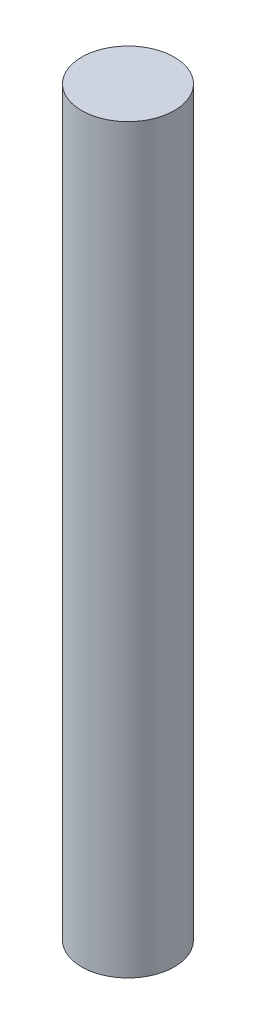
ISO-10303-21;
HEADER;
FILE_DESCRIPTION(('STEP AP214'),'2;1');
FILE_NAME('part.step','',(''),(''),'','','');
FILE_SCHEMA(('AUTOMOTIVE_DESIGN { 1 0 10303 214 1 1 1 1 }'));
ENDSEC;
DATA;
#1=APPLICATION_CONTEXT('core data for automotive mechanical design processes');
#2=APPLICATION_PROTOCOL_DEFINITION('international standard','automotive_design',2000,#1);
#3=PRODUCT_CONTEXT('',#1,'mechanical');
#4=PRODUCT('Part','Part','',(#3));
#5=PRODUCT_RELATED_PRODUCT_CATEGORY('part','',(#4));
#6=PRODUCT_DEFINITION_FORMATION('','',#4);
#7=PRODUCT_DEFINITION_CONTEXT('part definition',#1,'design');
#8=PRODUCT_DEFINITION('design','',#6,#7);
#9=PRODUCT_DEFINITION_SHAPE('','',#8);
#10=(LENGTH_UNIT() NAMED_UNIT(*) SI_UNIT(.MILLI.,.METRE.));
#11=(NAMED_UNIT(*) PLANE_ANGLE_UNIT() SI_UNIT($,.RADIAN.));
#12=(NAMED_UNIT(*) SI_UNIT($,.STERADIAN.) SOLID_ANGLE_UNIT());
#13=UNCERTAINTY_MEASURE_WITH_UNIT(LENGTH_MEASURE(1.E-05),#10,'distance_accuracy_value','');
#14=(GEOMETRIC_REPRESENTATION_CONTEXT(3) GLOBAL_UNCERTAINTY_ASSIGNED_CONTEXT((#13)) GLOBAL_UNIT_ASSIGNED_CONTEXT((#10,
#11,#12)) REPRESENTATION_CONTEXT('',''));
#15=CARTESIAN_POINT('',(0.,0.,0.));
#16=DIRECTION('',(0.,0.,1.));
#17=DIRECTION('',(1.,0.,0.));
#18=AXIS2_PLACEMENT_3D('',#15,#16,#17);
#19=CARTESIAN_POINT('',(0.,40.,0.));
#20=DIRECTION('',(0.,-1.,0.));
#21=DIRECTION('',(0.,0.,-1.));
#22=AXIS2_PLACEMENT_3D('',#19,#20,#21);
#23=CYLINDRICAL_SURFACE('',#22,2.5);
#24=CARTESIAN_POINT('',(0.,40.,0.));
#25=DIRECTION('',(0.,1.,0.));
#26=DIRECTION('',(0.,0.,1.));
#27=AXIS2_PLACEMENT_3D('',#24,#25,#26);
#28=CIRCLE('',#27,2.5);
#29=CARTESIAN_POINT('',(0.,40.,2.5));
#30=VERTEX_POINT('',#29);
#31=EDGE_CURVE('E10',#30,#30,#28,.T.);
#32=ORIENTED_EDGE('',*,*,#31,.F.);
#33=EDGE_LOOP('',(#32));
#34=FACE_BOUND('',#33,.T.);
#35=CARTESIAN_POINT('',(0.,0.,0.));
#36=DIRECTION('',(0.,1.,0.));
#37=DIRECTION('',(0.,0.,1.));
#38=AXIS2_PLACEMENT_3D('',#35,#36,#37);
#39=CIRCLE('',#38,2.5);
#40=CARTESIAN_POINT('',(0.,0.,2.5));
#41=VERTEX_POINT('',#40);
#42=EDGE_CURVE('E40',#41,#41,#39,.T.);
#43=ORIENTED_EDGE('',*,*,#42,.T.);
#44=EDGE_LOOP('',(#43));
#45=FACE_BOUND('',#44,.T.);
#46=ADVANCED_FACE('F37',(#34,#45),#23,.T.);
#47=CARTESIAN_POINT('',(0.,40.,0.));
#48=DIRECTION('',(0.,1.,0.));
#49=DIRECTION('',(0.,0.,1.));
#50=AXIS2_PLACEMENT_3D('',#47,#48,#49);
#51=PLANE('',#50);
#52=ORIENTED_EDGE('',*,*,#31,.T.);
#53=EDGE_LOOP('',(#52));
#54=FACE_BOUND('',#53,.T.);
#55=ADVANCED_FACE('F52',(#54),#51,.T.);
#56=CARTESIAN_POINT('',(0.,0.,0.));
#57=DIRECTION('',(0.,1.,0.));
#58=DIRECTION('',(0.,0.,1.));
#59=AXIS2_PLACEMENT_3D('',#56,#57,#58);
#60=PLANE('',#59);
#61=ORIENTED_EDGE('',*,*,#42,.F.);
#62=EDGE_LOOP('',(#61));
#63=FACE_BOUND('',#62,.T.);
#64=ADVANCED_FACE('F50',(#63),#60,.F.);
#65=CLOSED_SHELL('',(#46,#55,#64));
#66=MANIFOLD_SOLID_BREP('B2',#65);
#67=ADVANCED_BREP_SHAPE_REPRESENTATION('',(#18,#66),#14);
#68=SHAPE_DEFINITION_REPRESENTATION(#9,#67);
ENDSEC;
END-ISO-10303-21;
